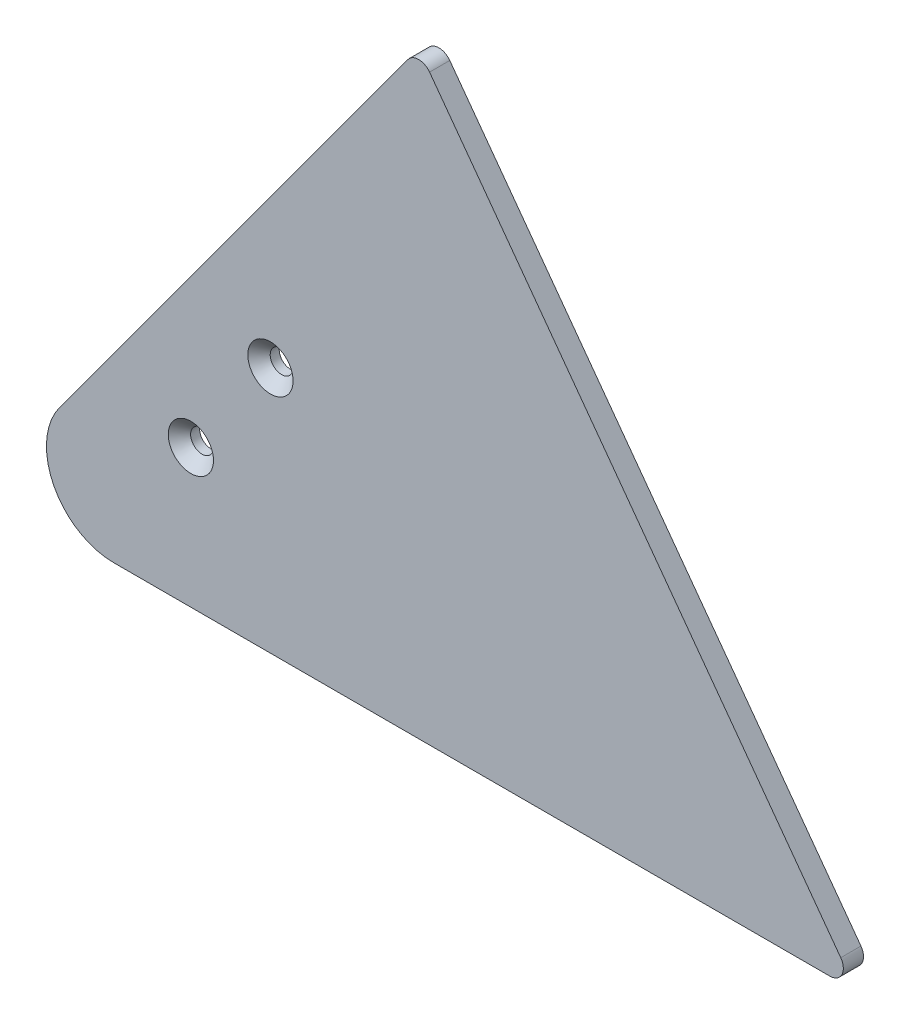
ISO-10303-21;
HEADER;
FILE_DESCRIPTION(('STEP AP214'),'2;1');
FILE_NAME('part.step','',(''),(''),'','','');
FILE_SCHEMA(('AUTOMOTIVE_DESIGN { 1 0 10303 214 1 1 1 1 }'));
ENDSEC;
DATA;
#1=APPLICATION_CONTEXT('core data for automotive mechanical design processes');
#2=APPLICATION_PROTOCOL_DEFINITION('international standard','automotive_design',2000,#1);
#3=PRODUCT_CONTEXT('',#1,'mechanical');
#4=PRODUCT('Part','Part','',(#3));
#5=PRODUCT_RELATED_PRODUCT_CATEGORY('part','',(#4));
#6=PRODUCT_DEFINITION_FORMATION('','',#4);
#7=PRODUCT_DEFINITION_CONTEXT('part definition',#1,'design');
#8=PRODUCT_DEFINITION('design','',#6,#7);
#9=PRODUCT_DEFINITION_SHAPE('','',#8);
#10=(LENGTH_UNIT() NAMED_UNIT(*) SI_UNIT(.MILLI.,.METRE.));
#11=(NAMED_UNIT(*) PLANE_ANGLE_UNIT() SI_UNIT($,.RADIAN.));
#12=(NAMED_UNIT(*) SI_UNIT($,.STERADIAN.) SOLID_ANGLE_UNIT());
#13=UNCERTAINTY_MEASURE_WITH_UNIT(LENGTH_MEASURE(1.E-05),#10,'distance_accuracy_value','');
#14=(GEOMETRIC_REPRESENTATION_CONTEXT(3) GLOBAL_UNCERTAINTY_ASSIGNED_CONTEXT((#13)) GLOBAL_UNIT_ASSIGNED_CONTEXT((#10,
#11,#12)) REPRESENTATION_CONTEXT('',''));
#15=CARTESIAN_POINT('',(0.,0.,0.));
#16=DIRECTION('',(0.,0.,1.));
#17=DIRECTION('',(1.,0.,0.));
#18=AXIS2_PLACEMENT_3D('',#15,#16,#17);
#19=CARTESIAN_POINT('',(0.,0.,0.));
#20=DIRECTION('',(0.,0.,-1.));
#21=DIRECTION('',(-1.,0.,0.));
#22=AXIS2_PLACEMENT_3D('',#19,#20,#21);
#23=PLANE('',#22);
#24=DIRECTION('',(-0.590909090909091,-0.806738152240857,0.));
#25=VECTOR('',#24,1.);
#26=CARTESIAN_POINT('',(65.,88.7411967464942,0.));
#27=LINE('',#26,#25);
#28=CARTESIAN_POINT('',(63.3865236955183,86.538399543697,0.));
#29=VERTEX_POINT('',#28);
#30=CARTESIAN_POINT('',(11.6528844212568,15.9090909090909,0.));
#31=VERTEX_POINT('',#30);
#32=EDGE_CURVE('E119',#29,#31,#27,.T.);
#33=ORIENTED_EDGE('',*,*,#32,.F.);
#34=CARTESIAN_POINT('',(65.,85.3565813618789,0.));
#35=DIRECTION('',(0.,0.,-1.));
#36=DIRECTION('',(-1.,0.,0.));
#37=AXIS2_PLACEMENT_3D('',#34,#35,#36);
#38=CIRCLE('',#37,2.);
#39=CARTESIAN_POINT('',(66.6134763044817,86.5383995436971,0.));
#40=VERTEX_POINT('',#39);
#41=EDGE_CURVE('E140',#29,#40,#38,.T.);
#42=ORIENTED_EDGE('',*,*,#41,.T.);
#43=DIRECTION('',(-0.590909090909091,0.806738152240857,0.));
#44=VECTOR('',#43,1.);
#45=CARTESIAN_POINT('',(130.,0.,0.));
#46=LINE('',#45,#44);
#47=CARTESIAN_POINT('',(127.669423115749,3.18181818181819,0.));
#48=VERTEX_POINT('',#47);
#49=EDGE_CURVE('E118',#48,#40,#46,.T.);
#50=ORIENTED_EDGE('',*,*,#49,.F.);
#51=CARTESIAN_POINT('',(126.055946811267,2.,0.));
#52=DIRECTION('',(0.,0.,-1.));
#53=DIRECTION('',(-1.,0.,0.));
#54=AXIS2_PLACEMENT_3D('',#51,#52,#53);
#55=CIRCLE('',#54,2.);
#56=CARTESIAN_POINT('',(126.055946811267,0.,0.));
#57=VERTEX_POINT('',#56);
#58=EDGE_CURVE('E116',#48,#57,#55,.T.);
#59=ORIENTED_EDGE('',*,*,#58,.T.);
#60=DIRECTION('',(1.,0.,0.));
#61=VECTOR('',#60,1.);
#62=CARTESIAN_POINT('',(0.,0.,0.));
#63=LINE('',#62,#61);
#64=CARTESIAN_POINT('',(19.7202659436654,0.,0.));
#65=VERTEX_POINT('',#64);
#66=EDGE_CURVE('E109',#65,#57,#63,.T.);
#67=ORIENTED_EDGE('',*,*,#66,.F.);
#68=CARTESIAN_POINT('',(19.7202659436654,10.,0.));
#69=DIRECTION('',(0.,0.,-1.));
#70=DIRECTION('',(-1.,0.,0.));
#71=AXIS2_PLACEMENT_3D('',#68,#69,#70);
#72=CIRCLE('',#71,10.);
#73=EDGE_CURVE('E96',#65,#31,#72,.T.);
#74=ORIENTED_EDGE('',*,*,#73,.T.);
#75=EDGE_LOOP('',(#33,#42,#50,#59,#67,#74));
#76=FACE_BOUND('',#75,.T.);
#77=CARTESIAN_POINT('',(31.1694141609493,20.5540171466118,0.));
#78=DIRECTION('',(0.,0.,1.));
#79=DIRECTION('',(1.,0.,0.));
#80=AXIS2_PLACEMENT_3D('',#77,#78,#79);
#81=CIRCLE('',#80,1.69999999999999);
#82=CARTESIAN_POINT('',(32.8694141609493,20.5540171466118,0.));
#83=VERTEX_POINT('',#82);
#84=EDGE_CURVE('E125',#83,#83,#81,.T.);
#85=ORIENTED_EDGE('',*,*,#84,.T.);
#86=EDGE_LOOP('',(#85));
#87=FACE_BOUND('',#86,.T.);
#88=CARTESIAN_POINT('',(42.9875959791311,36.6887801914289,0.));
#89=DIRECTION('',(0.,0.,1.));
#90=DIRECTION('',(1.,0.,0.));
#91=AXIS2_PLACEMENT_3D('',#88,#89,#90);
#92=CIRCLE('',#91,1.69999999999999);
#93=CARTESIAN_POINT('',(44.6875959791311,36.6887801914289,0.));
#94=VERTEX_POINT('',#93);
#95=EDGE_CURVE('E183',#94,#94,#92,.T.);
#96=ORIENTED_EDGE('',*,*,#95,.T.);
#97=EDGE_LOOP('',(#96));
#98=FACE_BOUND('',#97,.T.);
#99=ADVANCED_FACE('F39',(#76,#87,#98),#23,.T.);
#100=CARTESIAN_POINT('',(0.,0.,3.));
#101=DIRECTION('',(0.,0.,-1.));
#102=DIRECTION('',(-1.,0.,0.));
#103=AXIS2_PLACEMENT_3D('',#100,#101,#102);
#104=PLANE('',#103);
#105=DIRECTION('',(-0.590909090909091,0.806738152240857,0.));
#106=VECTOR('',#105,1.);
#107=CARTESIAN_POINT('',(130.,0.,3.));
#108=LINE('',#107,#106);
#109=CARTESIAN_POINT('',(127.669423115749,3.18181818181819,3.));
#110=VERTEX_POINT('',#109);
#111=CARTESIAN_POINT('',(66.6134763044817,86.5383995436971,3.));
#112=VERTEX_POINT('',#111);
#113=EDGE_CURVE('E112',#110,#112,#108,.T.);
#114=ORIENTED_EDGE('',*,*,#113,.T.);
#115=CARTESIAN_POINT('',(65.,85.3565813618789,3.));
#116=DIRECTION('',(0.,0.,-1.));
#117=DIRECTION('',(-1.,0.,0.));
#118=AXIS2_PLACEMENT_3D('',#115,#116,#117);
#119=CIRCLE('',#118,2.);
#120=CARTESIAN_POINT('',(63.3865236955183,86.538399543697,3.));
#121=VERTEX_POINT('',#120);
#122=EDGE_CURVE('E48',#112,#121,#119,.F.);
#123=ORIENTED_EDGE('',*,*,#122,.T.);
#124=DIRECTION('',(-0.590909090909091,-0.806738152240857,0.));
#125=VECTOR('',#124,1.);
#126=CARTESIAN_POINT('',(65.,88.7411967464942,3.));
#127=LINE('',#126,#125);
#128=CARTESIAN_POINT('',(11.6528844212568,15.9090909090909,3.));
#129=VERTEX_POINT('',#128);
#130=EDGE_CURVE('E123',#121,#129,#127,.T.);
#131=ORIENTED_EDGE('',*,*,#130,.T.);
#132=CARTESIAN_POINT('',(19.7202659436654,10.,3.));
#133=DIRECTION('',(0.,0.,-1.));
#134=DIRECTION('',(-1.,0.,0.));
#135=AXIS2_PLACEMENT_3D('',#132,#133,#134);
#136=CIRCLE('',#135,10.);
#137=CARTESIAN_POINT('',(19.7202659436654,0.,3.));
#138=VERTEX_POINT('',#137);
#139=EDGE_CURVE('E131',#129,#138,#136,.F.);
#140=ORIENTED_EDGE('',*,*,#139,.T.);
#141=DIRECTION('',(1.,0.,0.));
#142=VECTOR('',#141,1.);
#143=CARTESIAN_POINT('',(0.,0.,3.));
#144=LINE('',#143,#142);
#145=CARTESIAN_POINT('',(126.055946811267,0.,3.));
#146=VERTEX_POINT('',#145);
#147=EDGE_CURVE('E110',#138,#146,#144,.T.);
#148=ORIENTED_EDGE('',*,*,#147,.T.);
#149=CARTESIAN_POINT('',(126.055946811267,2.,3.));
#150=DIRECTION('',(0.,0.,-1.));
#151=DIRECTION('',(-1.,0.,0.));
#152=AXIS2_PLACEMENT_3D('',#149,#150,#151);
#153=CIRCLE('',#152,2.);
#154=EDGE_CURVE('E149',#146,#110,#153,.F.);
#155=ORIENTED_EDGE('',*,*,#154,.T.);
#156=EDGE_LOOP('',(#114,#123,#131,#140,#148,#155));
#157=FACE_BOUND('',#156,.T.);
#158=CARTESIAN_POINT('',(31.1694141609493,20.5540171466118,3.));
#159=DIRECTION('',(0.,0.,1.));
#160=DIRECTION('',(1.,0.,0.));
#161=AXIS2_PLACEMENT_3D('',#158,#159,#160);
#162=CIRCLE('',#161,3.36);
#163=CARTESIAN_POINT('',(34.5294141609493,20.5540171466118,3.));
#164=VERTEX_POINT('',#163);
#165=EDGE_CURVE('E179',#164,#164,#162,.T.);
#166=ORIENTED_EDGE('',*,*,#165,.F.);
#167=EDGE_LOOP('',(#166));
#168=FACE_BOUND('',#167,.T.);
#169=CARTESIAN_POINT('',(42.9875959791311,36.6887801914289,3.));
#170=DIRECTION('',(0.,0.,1.));
#171=DIRECTION('',(1.,0.,0.));
#172=AXIS2_PLACEMENT_3D('',#169,#170,#171);
#173=CIRCLE('',#172,3.36);
#174=CARTESIAN_POINT('',(46.3475959791311,36.6887801914289,3.));
#175=VERTEX_POINT('',#174);
#176=EDGE_CURVE('E191',#175,#175,#173,.T.);
#177=ORIENTED_EDGE('',*,*,#176,.F.);
#178=EDGE_LOOP('',(#177));
#179=FACE_BOUND('',#178,.T.);
#180=ADVANCED_FACE('F155',(#157,#168,#179),#104,.F.);
#181=CARTESIAN_POINT('',(65.,88.7411967464942,3.));
#182=DIRECTION('',(0.806738152240857,-0.590909090909091,0.));
#183=DIRECTION('',(0.590909090909091,0.806738152240857,0.));
#184=AXIS2_PLACEMENT_3D('',#181,#182,#183);
#185=PLANE('',#184);
#186=ORIENTED_EDGE('',*,*,#130,.F.);
#187=DIRECTION('',(0.,0.,-1.));
#188=VECTOR('',#187,1.);
#189=CARTESIAN_POINT('',(63.3865236955183,86.538399543697,3.));
#190=LINE('',#189,#188);
#191=EDGE_CURVE('E134',#121,#29,#190,.T.);
#192=ORIENTED_EDGE('',*,*,#191,.T.);
#193=ORIENTED_EDGE('',*,*,#32,.T.);
#194=DIRECTION('',(0.,0.,-1.));
#195=VECTOR('',#194,1.);
#196=CARTESIAN_POINT('',(11.6528844212568,15.9090909090909,3.));
#197=LINE('',#196,#195);
#198=EDGE_CURVE('E102',#31,#129,#197,.F.);
#199=ORIENTED_EDGE('',*,*,#198,.T.);
#200=EDGE_LOOP('',(#186,#192,#193,#199));
#201=FACE_BOUND('',#200,.T.);
#202=ADVANCED_FACE('F160',(#201),#185,.F.);
#203=CARTESIAN_POINT('',(0.,0.,3.));
#204=DIRECTION('',(0.,1.,0.));
#205=DIRECTION('',(0.,0.,1.));
#206=AXIS2_PLACEMENT_3D('',#203,#204,#205);
#207=PLANE('',#206);
#208=ORIENTED_EDGE('',*,*,#66,.T.);
#209=DIRECTION('',(0.,0.,-1.));
#210=VECTOR('',#209,1.);
#211=CARTESIAN_POINT('',(126.055946811267,0.,3.));
#212=LINE('',#211,#210);
#213=EDGE_CURVE('E11',#57,#146,#212,.F.);
#214=ORIENTED_EDGE('',*,*,#213,.T.);
#215=ORIENTED_EDGE('',*,*,#147,.F.);
#216=DIRECTION('',(0.,0.,-1.));
#217=VECTOR('',#216,1.);
#218=CARTESIAN_POINT('',(19.7202659436654,0.,3.));
#219=LINE('',#218,#217);
#220=EDGE_CURVE('E100',#138,#65,#219,.T.);
#221=ORIENTED_EDGE('',*,*,#220,.T.);
#222=EDGE_LOOP('',(#208,#214,#215,#221));
#223=FACE_BOUND('',#222,.T.);
#224=ADVANCED_FACE('F108',(#223),#207,.F.);
#225=CARTESIAN_POINT('',(130.,0.,3.));
#226=DIRECTION('',(-0.806738152240857,-0.590909090909091,0.));
#227=DIRECTION('',(0.590909090909091,-0.806738152240857,0.));
#228=AXIS2_PLACEMENT_3D('',#225,#226,#227);
#229=PLANE('',#228);
#230=ORIENTED_EDGE('',*,*,#49,.T.);
#231=DIRECTION('',(0.,0.,-1.));
#232=VECTOR('',#231,1.);
#233=CARTESIAN_POINT('',(66.6134763044817,86.538399543697,3.));
#234=LINE('',#233,#232);
#235=EDGE_CURVE('E61',#40,#112,#234,.F.);
#236=ORIENTED_EDGE('',*,*,#235,.T.);
#237=ORIENTED_EDGE('',*,*,#113,.F.);
#238=DIRECTION('',(0.,0.,-1.));
#239=VECTOR('',#238,1.);
#240=CARTESIAN_POINT('',(127.669423115749,3.18181818181819,3.));
#241=LINE('',#240,#239);
#242=EDGE_CURVE('E143',#110,#48,#241,.T.);
#243=ORIENTED_EDGE('',*,*,#242,.T.);
#244=EDGE_LOOP('',(#230,#236,#237,#243));
#245=FACE_BOUND('',#244,.T.);
#246=ADVANCED_FACE('F164',(#245),#229,.F.);
#247=CARTESIAN_POINT('',(19.7202659436654,10.,3.));
#248=DIRECTION('',(0.,0.,-1.));
#249=DIRECTION('',(-1.,0.,0.));
#250=AXIS2_PLACEMENT_3D('',#247,#248,#249);
#251=CYLINDRICAL_SURFACE('',#250,10.);
#252=ORIENTED_EDGE('',*,*,#139,.F.);
#253=ORIENTED_EDGE('',*,*,#198,.F.);
#254=ORIENTED_EDGE('',*,*,#73,.F.);
#255=ORIENTED_EDGE('',*,*,#220,.F.);
#256=EDGE_LOOP('',(#252,#253,#254,#255));
#257=FACE_BOUND('',#256,.T.);
#258=ADVANCED_FACE('F99',(#257),#251,.T.);
#259=CARTESIAN_POINT('',(65.,85.3565813618789,3.));
#260=DIRECTION('',(0.,0.,-1.));
#261=DIRECTION('',(-1.,0.,0.));
#262=AXIS2_PLACEMENT_3D('',#259,#260,#261);
#263=CYLINDRICAL_SURFACE('',#262,2.);
#264=ORIENTED_EDGE('',*,*,#122,.F.);
#265=ORIENTED_EDGE('',*,*,#235,.F.);
#266=ORIENTED_EDGE('',*,*,#41,.F.);
#267=ORIENTED_EDGE('',*,*,#191,.F.);
#268=EDGE_LOOP('',(#264,#265,#266,#267));
#269=FACE_BOUND('',#268,.T.);
#270=ADVANCED_FACE('F163',(#269),#263,.T.);
#271=CARTESIAN_POINT('',(126.055946811267,2.,3.));
#272=DIRECTION('',(0.,0.,-1.));
#273=DIRECTION('',(-1.,0.,0.));
#274=AXIS2_PLACEMENT_3D('',#271,#272,#273);
#275=CYLINDRICAL_SURFACE('',#274,2.);
#276=ORIENTED_EDGE('',*,*,#154,.F.);
#277=ORIENTED_EDGE('',*,*,#213,.F.);
#278=ORIENTED_EDGE('',*,*,#58,.F.);
#279=ORIENTED_EDGE('',*,*,#242,.F.);
#280=EDGE_LOOP('',(#276,#277,#278,#279));
#281=FACE_BOUND('',#280,.T.);
#282=ADVANCED_FACE('F41',(#281),#275,.T.);
#283=CARTESIAN_POINT('',(31.1694141609493,20.5540171466118,3.));
#284=DIRECTION('',(0.,0.,1.));
#285=DIRECTION('',(1.,0.,0.));
#286=AXIS2_PLACEMENT_3D('',#283,#284,#285);
#287=CYLINDRICAL_SURFACE('',#286,1.69999999999999);
#288=ORIENTED_EDGE('',*,*,#84,.F.);
#289=EDGE_LOOP('',(#288));
#290=FACE_BOUND('',#289,.T.);
#291=CARTESIAN_POINT('',(31.1694141609493,20.5540171466118,1.33999999999998));
#292=DIRECTION('',(0.,0.,1.));
#293=DIRECTION('',(1.,0.,0.));
#294=AXIS2_PLACEMENT_3D('',#291,#292,#293);
#295=CIRCLE('',#294,1.69999999999999);
#296=CARTESIAN_POINT('',(32.8694141609493,20.5540171466118,1.33999999999998));
#297=VERTEX_POINT('',#296);
#298=EDGE_CURVE('E175',#297,#297,#295,.T.);
#299=ORIENTED_EDGE('',*,*,#298,.T.);
#300=EDGE_LOOP('',(#299));
#301=FACE_BOUND('',#300,.T.);
#302=ADVANCED_FACE('F207',(#290,#301),#287,.F.);
#303=CARTESIAN_POINT('',(31.1694141609493,20.5540171466118,3.));
#304=DIRECTION('',(0.,0.,1.));
#305=DIRECTION('',(1.,0.,0.));
#306=AXIS2_PLACEMENT_3D('',#303,#304,#305);
#307=CONICAL_SURFACE('',#306,3.36,0.785398163397446);
#308=ORIENTED_EDGE('',*,*,#298,.F.);
#309=EDGE_LOOP('',(#308));
#310=FACE_BOUND('',#309,.T.);
#311=ORIENTED_EDGE('',*,*,#165,.T.);
#312=EDGE_LOOP('',(#311));
#313=FACE_BOUND('',#312,.T.);
#314=ADVANCED_FACE('F222',(#310,#313),#307,.F.);
#315=CARTESIAN_POINT('',(42.9875959791311,36.6887801914289,3.));
#316=DIRECTION('',(0.,0.,1.));
#317=DIRECTION('',(1.,0.,0.));
#318=AXIS2_PLACEMENT_3D('',#315,#316,#317);
#319=CYLINDRICAL_SURFACE('',#318,1.69999999999999);
#320=ORIENTED_EDGE('',*,*,#95,.F.);
#321=EDGE_LOOP('',(#320));
#322=FACE_BOUND('',#321,.T.);
#323=CARTESIAN_POINT('',(42.9875959791311,36.6887801914289,1.33999999999998));
#324=DIRECTION('',(0.,0.,1.));
#325=DIRECTION('',(1.,0.,0.));
#326=AXIS2_PLACEMENT_3D('',#323,#324,#325);
#327=CIRCLE('',#326,1.69999999999999);
#328=CARTESIAN_POINT('',(44.6875959791311,36.6887801914289,1.33999999999998));
#329=VERTEX_POINT('',#328);
#330=EDGE_CURVE('E187',#329,#329,#327,.T.);
#331=ORIENTED_EDGE('',*,*,#330,.T.);
#332=EDGE_LOOP('',(#331));
#333=FACE_BOUND('',#332,.T.);
#334=ADVANCED_FACE('F227',(#322,#333),#319,.F.);
#335=CARTESIAN_POINT('',(42.9875959791311,36.6887801914289,3.));
#336=DIRECTION('',(0.,0.,1.));
#337=DIRECTION('',(1.,0.,0.));
#338=AXIS2_PLACEMENT_3D('',#335,#336,#337);
#339=CONICAL_SURFACE('',#338,3.36,0.785398163397446);
#340=ORIENTED_EDGE('',*,*,#330,.F.);
#341=EDGE_LOOP('',(#340));
#342=FACE_BOUND('',#341,.T.);
#343=ORIENTED_EDGE('',*,*,#176,.T.);
#344=EDGE_LOOP('',(#343));
#345=FACE_BOUND('',#344,.T.);
#346=ADVANCED_FACE('F196',(#342,#345),#339,.F.);
#347=CLOSED_SHELL('',(#99,#180,#202,#224,#246,#258,#270,#282,#302,#314,#334,#346));
#348=MANIFOLD_SOLID_BREP('B2',#347);
#349=ADVANCED_BREP_SHAPE_REPRESENTATION('',(#18,#348),#14);
#350=SHAPE_DEFINITION_REPRESENTATION(#9,#349);
ENDSEC;
END-ISO-10303-21;
